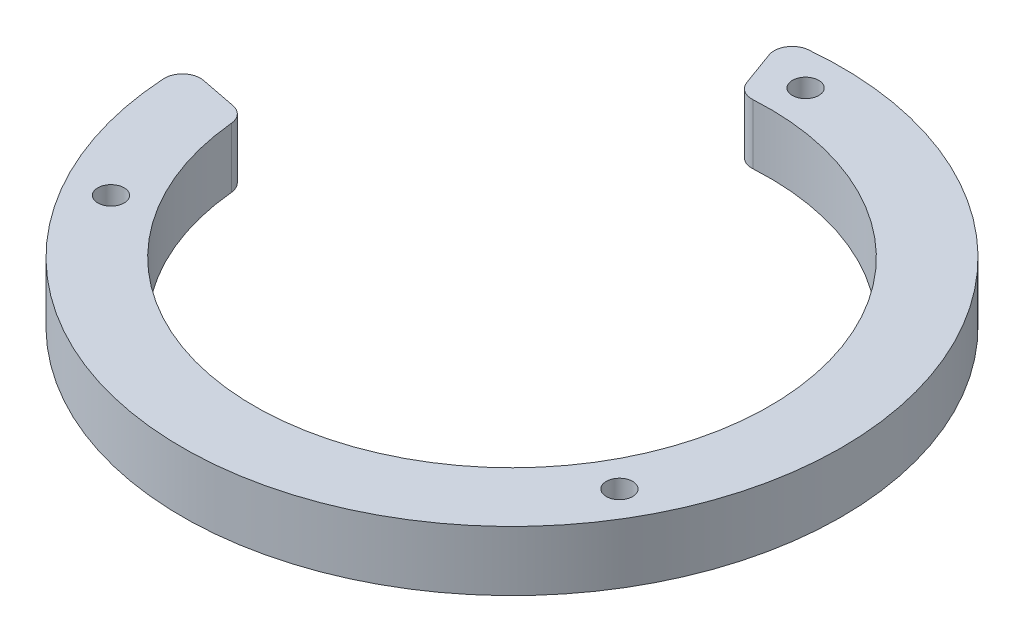
ISO-10303-21;
HEADER;
FILE_DESCRIPTION(('STEP AP214'),'2;1');
FILE_NAME('part.step','',(''),(''),'','','');
FILE_SCHEMA(('AUTOMOTIVE_DESIGN { 1 0 10303 214 1 1 1 1 }'));
ENDSEC;
DATA;
#1=APPLICATION_CONTEXT('core data for automotive mechanical design processes');
#2=APPLICATION_PROTOCOL_DEFINITION('international standard','automotive_design',2000,#1);
#3=PRODUCT_CONTEXT('',#1,'mechanical');
#4=PRODUCT('Part','Part','',(#3));
#5=PRODUCT_RELATED_PRODUCT_CATEGORY('part','',(#4));
#6=PRODUCT_DEFINITION_FORMATION('','',#4);
#7=PRODUCT_DEFINITION_CONTEXT('part definition',#1,'design');
#8=PRODUCT_DEFINITION('design','',#6,#7);
#9=PRODUCT_DEFINITION_SHAPE('','',#8);
#10=(LENGTH_UNIT() NAMED_UNIT(*) SI_UNIT(.MILLI.,.METRE.));
#11=(NAMED_UNIT(*) PLANE_ANGLE_UNIT() SI_UNIT($,.RADIAN.));
#12=(NAMED_UNIT(*) SI_UNIT($,.STERADIAN.) SOLID_ANGLE_UNIT());
#13=UNCERTAINTY_MEASURE_WITH_UNIT(LENGTH_MEASURE(1.E-05),#10,'distance_accuracy_value','');
#14=(GEOMETRIC_REPRESENTATION_CONTEXT(3) GLOBAL_UNCERTAINTY_ASSIGNED_CONTEXT((#13)) GLOBAL_UNIT_ASSIGNED_CONTEXT((#10,
#11,#12)) REPRESENTATION_CONTEXT('',''));
#15=CARTESIAN_POINT('',(0.,0.,0.));
#16=DIRECTION('',(0.,0.,1.));
#17=DIRECTION('',(1.,0.,0.));
#18=AXIS2_PLACEMENT_3D('',#15,#16,#17);
#19=CARTESIAN_POINT('',(0.,5.,0.));
#20=DIRECTION('',(0.,1.,0.));
#21=DIRECTION('',(0.,0.,1.));
#22=AXIS2_PLACEMENT_3D('',#19,#20,#21);
#23=PLANE('',#22);
#24=CARTESIAN_POINT('',(0.,5.,0.));
#25=DIRECTION('',(0.,1.,0.));
#26=DIRECTION('',(0.,0.,1.));
#27=AXIS2_PLACEMENT_3D('',#24,#25,#26);
#28=CIRCLE('',#27,27.5);
#29=CARTESIAN_POINT('',(-27.4512818962212,5.,1.63619138678829));
#30=VERTEX_POINT('',#29);
#31=CARTESIAN_POINT('',(-2.6465016763753,5.,-27.3723588475115));
#32=VERTEX_POINT('',#31);
#33=EDGE_CURVE('E175',#30,#32,#28,.T.);
#34=ORIENTED_EDGE('',*,*,#33,.T.);
#35=CARTESIAN_POINT('',(-2.5021470394821,5.,-25.8793210921927));
#36=DIRECTION('',(0.,1.,0.));
#37=DIRECTION('',(0.,0.,1.));
#38=AXIS2_PLACEMENT_3D('',#35,#36,#37);
#39=CIRCLE('',#38,1.5);
#40=CARTESIAN_POINT('',(-3.91168597066097,5.,-25.3662908772042));
#41=VERTEX_POINT('',#40);
#42=EDGE_CURVE('E203',#32,#41,#39,.T.);
#43=ORIENTED_EDGE('',*,*,#42,.T.);
#44=DIRECTION('',(0.342020143325664,0.,0.93969262078591));
#45=VECTOR('',#44,1.);
#46=CARTESIAN_POINT('',(-2.45335719744214,5.,-21.3595655026444));
#47=LINE('',#46,#45);
#48=CARTESIAN_POINT('',(-2.84732603014498,5.,-22.4419859744644));
#49=VERTEX_POINT('',#48);
#50=EDGE_CURVE('E125',#41,#49,#47,.T.);
#51=ORIENTED_EDGE('',*,*,#50,.T.);
#52=CARTESIAN_POINT('',(-1.43778709896612,5.,-22.9550161894529));
#53=DIRECTION('',(0.,1.,0.));
#54=DIRECTION('',(0.,0.,1.));
#55=AXIS2_PLACEMENT_3D('',#52,#53,#54);
#56=CIRCLE('',#55,1.5);
#57=CARTESIAN_POINT('',(-1.3440183751205,5.,-21.4579499162277));
#58=VERTEX_POINT('',#57);
#59=EDGE_CURVE('E200',#49,#58,#56,.T.);
#60=ORIENTED_EDGE('',*,*,#59,.T.);
#61=CARTESIAN_POINT('',(0.,5.,0.));
#62=DIRECTION('',(0.,1.,0.));
#63=DIRECTION('',(0.,0.,1.));
#64=AXIS2_PLACEMENT_3D('',#61,#62,#63);
#65=CIRCLE('',#64,21.5);
#66=CARTESIAN_POINT('',(-21.4063593406248,5.,2.00444001657446));
#67=VERTEX_POINT('',#66);
#68=EDGE_CURVE('E168',#67,#58,#65,.T.);
#69=ORIENTED_EDGE('',*,*,#68,.F.);
#70=CARTESIAN_POINT('',(-22.8998262713661,5.,2.1442846688936));
#71=DIRECTION('',(0.,1.,0.));
#72=DIRECTION('',(0.,0.,1.));
#73=AXIS2_PLACEMENT_3D('',#70,#71,#72);
#74=CIRCLE('',#73,1.5);
#75=CARTESIAN_POINT('',(-22.6119034544936,5.,0.67217718249045));
#76=VERTEX_POINT('',#75);
#77=EDGE_CURVE('E59',#67,#76,#74,.T.);
#78=ORIENTED_EDGE('',*,*,#77,.T.);
#79=DIRECTION('',(-0.981404990935436,0.,-0.191948544581656));
#80=VECTOR('',#79,1.);
#81=CARTESIAN_POINT('',(-21.4814350121146,5.,0.893280370485552));
#82=LINE('',#81,#80);
#83=CARTESIAN_POINT('',(-25.6660164304639,5.,0.0748370974694069));
#84=VERTEX_POINT('',#83);
#85=EDGE_CURVE('E134',#76,#84,#82,.T.);
#86=ORIENTED_EDGE('',*,*,#85,.T.);
#87=CARTESIAN_POINT('',(-25.9539392473364,5.,1.54694458387256));
#88=DIRECTION('',(0.,1.,0.));
#89=DIRECTION('',(0.,0.,1.));
#90=AXIS2_PLACEMENT_3D('',#87,#88,#89);
#91=CIRCLE('',#90,1.5);
#92=EDGE_CURVE('E197',#84,#30,#91,.T.);
#93=ORIENTED_EDGE('',*,*,#92,.T.);
#94=EDGE_LOOP('',(#34,#43,#51,#60,#69,#78,#86,#93));
#95=FACE_BOUND('',#94,.T.);
#96=CARTESIAN_POINT('',(21.2176223927188,5.,12.25));
#97=DIRECTION('',(0.,1.,0.));
#98=DIRECTION('',(0.,0.,1.));
#99=AXIS2_PLACEMENT_3D('',#96,#97,#98);
#100=CIRCLE('',#99,1.1);
#101=CARTESIAN_POINT('',(21.2176223927188,5.,13.35));
#102=VERTEX_POINT('',#101);
#103=EDGE_CURVE('E152',#102,#102,#100,.T.);
#104=ORIENTED_EDGE('',*,*,#103,.F.);
#105=EDGE_LOOP('',(#104));
#106=FACE_BOUND('',#105,.T.);
#107=CARTESIAN_POINT('',(0.,5.,-24.5));
#108=DIRECTION('',(0.,1.,0.));
#109=DIRECTION('',(0.,0.,1.));
#110=AXIS2_PLACEMENT_3D('',#107,#108,#109);
#111=CIRCLE('',#110,1.1);
#112=CARTESIAN_POINT('',(0.,5.,-23.4));
#113=VERTEX_POINT('',#112);
#114=EDGE_CURVE('E160',#113,#113,#111,.T.);
#115=ORIENTED_EDGE('',*,*,#114,.F.);
#116=EDGE_LOOP('',(#115));
#117=FACE_BOUND('',#116,.T.);
#118=CARTESIAN_POINT('',(-21.2176223927187,5.,12.25));
#119=DIRECTION('',(0.,1.,0.));
#120=DIRECTION('',(0.,0.,1.));
#121=AXIS2_PLACEMENT_3D('',#118,#119,#120);
#122=CIRCLE('',#121,1.10000000000001);
#123=CARTESIAN_POINT('',(-21.2176223927187,5.,13.35));
#124=VERTEX_POINT('',#123);
#125=EDGE_CURVE('E143',#124,#124,#122,.T.);
#126=ORIENTED_EDGE('',*,*,#125,.F.);
#127=EDGE_LOOP('',(#126));
#128=FACE_BOUND('',#127,.T.);
#129=ADVANCED_FACE('F38',(#95,#106,#117,#128),#23,.T.);
#130=CARTESIAN_POINT('',(0.,0.,0.));
#131=DIRECTION('',(0.,1.,0.));
#132=DIRECTION('',(0.,0.,1.));
#133=AXIS2_PLACEMENT_3D('',#130,#131,#132);
#134=PLANE('',#133);
#135=DIRECTION('',(0.342020143325664,0.,0.93969262078591));
#136=VECTOR('',#135,1.);
#137=CARTESIAN_POINT('',(-2.45335719744214,0.,-21.3595655026444));
#138=LINE('',#137,#136);
#139=CARTESIAN_POINT('',(-3.91168597066097,0.,-25.3662908772042));
#140=VERTEX_POINT('',#139);
#141=CARTESIAN_POINT('',(-2.84732603014498,0.,-22.4419859744644));
#142=VERTEX_POINT('',#141);
#143=EDGE_CURVE('E122',#140,#142,#138,.T.);
#144=ORIENTED_EDGE('',*,*,#143,.F.);
#145=CARTESIAN_POINT('',(-2.5021470394821,0.,-25.8793210921927));
#146=DIRECTION('',(0.,1.,0.));
#147=DIRECTION('',(0.,0.,1.));
#148=AXIS2_PLACEMENT_3D('',#145,#146,#147);
#149=CIRCLE('',#148,1.5);
#150=CARTESIAN_POINT('',(-2.6465016763753,0.,-27.3723588475115));
#151=VERTEX_POINT('',#150);
#152=EDGE_CURVE('E104',#140,#151,#149,.F.);
#153=ORIENTED_EDGE('',*,*,#152,.T.);
#154=CARTESIAN_POINT('',(0.,0.,0.));
#155=DIRECTION('',(0.,1.,0.));
#156=DIRECTION('',(0.,0.,1.));
#157=AXIS2_PLACEMENT_3D('',#154,#155,#156);
#158=CIRCLE('',#157,27.5);
#159=CARTESIAN_POINT('',(-27.4512818962212,0.,1.63619138678829));
#160=VERTEX_POINT('',#159);
#161=EDGE_CURVE('E172',#160,#151,#158,.T.);
#162=ORIENTED_EDGE('',*,*,#161,.F.);
#163=CARTESIAN_POINT('',(-25.9539392473364,0.,1.54694458387256));
#164=DIRECTION('',(0.,1.,0.));
#165=DIRECTION('',(0.,0.,1.));
#166=AXIS2_PLACEMENT_3D('',#163,#164,#165);
#167=CIRCLE('',#166,1.5);
#168=CARTESIAN_POINT('',(-25.6660164304639,0.,0.0748370974694069));
#169=VERTEX_POINT('',#168);
#170=EDGE_CURVE('E185',#160,#169,#167,.F.);
#171=ORIENTED_EDGE('',*,*,#170,.T.);
#172=DIRECTION('',(-0.981404990935436,0.,-0.191948544581656));
#173=VECTOR('',#172,1.);
#174=CARTESIAN_POINT('',(-21.4814350121146,0.,0.893280370485552));
#175=LINE('',#174,#173);
#176=CARTESIAN_POINT('',(-22.6119034544936,0.,0.67217718249045));
#177=VERTEX_POINT('',#176);
#178=EDGE_CURVE('E135',#177,#169,#175,.T.);
#179=ORIENTED_EDGE('',*,*,#178,.F.);
#180=CARTESIAN_POINT('',(-22.8998262713661,0.,2.1442846688936));
#181=DIRECTION('',(0.,1.,0.));
#182=DIRECTION('',(0.,0.,1.));
#183=AXIS2_PLACEMENT_3D('',#180,#181,#182);
#184=CIRCLE('',#183,1.5);
#185=CARTESIAN_POINT('',(-21.4063593406248,0.,2.00444001657446));
#186=VERTEX_POINT('',#185);
#187=EDGE_CURVE('E127',#177,#186,#184,.F.);
#188=ORIENTED_EDGE('',*,*,#187,.T.);
#189=CARTESIAN_POINT('',(0.,0.,0.));
#190=DIRECTION('',(0.,1.,0.));
#191=DIRECTION('',(0.,0.,1.));
#192=AXIS2_PLACEMENT_3D('',#189,#190,#191);
#193=CIRCLE('',#192,21.5);
#194=CARTESIAN_POINT('',(-1.3440183751205,0.,-21.4579499162277));
#195=VERTEX_POINT('',#194);
#196=EDGE_CURVE('E164',#186,#195,#193,.T.);
#197=ORIENTED_EDGE('',*,*,#196,.T.);
#198=CARTESIAN_POINT('',(-1.43778709896612,0.,-22.9550161894529));
#199=DIRECTION('',(0.,1.,0.));
#200=DIRECTION('',(0.,0.,1.));
#201=AXIS2_PLACEMENT_3D('',#198,#199,#200);
#202=CIRCLE('',#201,1.5);
#203=EDGE_CURVE('E116',#195,#142,#202,.F.);
#204=ORIENTED_EDGE('',*,*,#203,.T.);
#205=EDGE_LOOP('',(#144,#153,#162,#171,#179,#188,#197,#204));
#206=FACE_BOUND('',#205,.T.);
#207=CARTESIAN_POINT('',(0.,0.,-24.5));
#208=DIRECTION('',(0.,1.,0.));
#209=DIRECTION('',(0.,0.,1.));
#210=AXIS2_PLACEMENT_3D('',#207,#208,#209);
#211=CIRCLE('',#210,1.1);
#212=CARTESIAN_POINT('',(0.,0.,-23.4));
#213=VERTEX_POINT('',#212);
#214=EDGE_CURVE('E156',#213,#213,#211,.T.);
#215=ORIENTED_EDGE('',*,*,#214,.T.);
#216=EDGE_LOOP('',(#215));
#217=FACE_BOUND('',#216,.T.);
#218=CARTESIAN_POINT('',(21.2176223927188,0.,12.25));
#219=DIRECTION('',(0.,1.,0.));
#220=DIRECTION('',(0.,0.,1.));
#221=AXIS2_PLACEMENT_3D('',#218,#219,#220);
#222=CIRCLE('',#221,1.1);
#223=CARTESIAN_POINT('',(21.2176223927188,0.,13.35));
#224=VERTEX_POINT('',#223);
#225=EDGE_CURVE('E147',#224,#224,#222,.T.);
#226=ORIENTED_EDGE('',*,*,#225,.T.);
#227=EDGE_LOOP('',(#226));
#228=FACE_BOUND('',#227,.T.);
#229=CARTESIAN_POINT('',(-21.2176223927187,0.,12.25));
#230=DIRECTION('',(0.,1.,0.));
#231=DIRECTION('',(0.,0.,1.));
#232=AXIS2_PLACEMENT_3D('',#229,#230,#231);
#233=CIRCLE('',#232,1.10000000000001);
#234=CARTESIAN_POINT('',(-21.2176223927187,0.,13.35));
#235=VERTEX_POINT('',#234);
#236=EDGE_CURVE('E148',#235,#235,#233,.T.);
#237=ORIENTED_EDGE('',*,*,#236,.T.);
#238=EDGE_LOOP('',(#237));
#239=FACE_BOUND('',#238,.T.);
#240=ADVANCED_FACE('F130',(#206,#217,#228,#239),#134,.F.);
#241=CARTESIAN_POINT('',(0.,5.,0.));
#242=DIRECTION('',(0.,-1.,0.));
#243=DIRECTION('',(0.,0.,-1.));
#244=AXIS2_PLACEMENT_3D('',#241,#242,#243);
#245=CYLINDRICAL_SURFACE('',#244,27.5);
#246=ORIENTED_EDGE('',*,*,#161,.T.);
#247=DIRECTION('',(0.,-1.,0.));
#248=VECTOR('',#247,1.);
#249=CARTESIAN_POINT('',(-2.6465016763753,5.,-27.3723588475115));
#250=LINE('',#249,#248);
#251=EDGE_CURVE('E109',#151,#32,#250,.F.);
#252=ORIENTED_EDGE('',*,*,#251,.T.);
#253=ORIENTED_EDGE('',*,*,#33,.F.);
#254=DIRECTION('',(0.,-1.,0.));
#255=VECTOR('',#254,1.);
#256=CARTESIAN_POINT('',(-27.4512818962212,5.,1.63619138678829));
#257=LINE('',#256,#255);
#258=EDGE_CURVE('E115',#30,#160,#257,.T.);
#259=ORIENTED_EDGE('',*,*,#258,.T.);
#260=EDGE_LOOP('',(#246,#252,#253,#259));
#261=FACE_BOUND('',#260,.T.);
#262=ADVANCED_FACE('F225',(#261),#245,.T.);
#263=CARTESIAN_POINT('',(0.,5.,0.));
#264=DIRECTION('',(0.,-1.,0.));
#265=DIRECTION('',(0.,0.,-1.));
#266=AXIS2_PLACEMENT_3D('',#263,#264,#265);
#267=CYLINDRICAL_SURFACE('',#266,21.5);
#268=ORIENTED_EDGE('',*,*,#68,.T.);
#269=DIRECTION('',(0.,-1.,0.));
#270=VECTOR('',#269,1.);
#271=CARTESIAN_POINT('',(-1.3440183751205,5.,-21.4579499162277));
#272=LINE('',#271,#270);
#273=EDGE_CURVE('E209',#58,#195,#272,.T.);
#274=ORIENTED_EDGE('',*,*,#273,.T.);
#275=ORIENTED_EDGE('',*,*,#196,.F.);
#276=DIRECTION('',(0.,-1.,0.));
#277=VECTOR('',#276,1.);
#278=CARTESIAN_POINT('',(-21.4063593406248,5.,2.00444001657446));
#279=LINE('',#278,#277);
#280=EDGE_CURVE('E206',#186,#67,#279,.F.);
#281=ORIENTED_EDGE('',*,*,#280,.T.);
#282=EDGE_LOOP('',(#268,#274,#275,#281));
#283=FACE_BOUND('',#282,.T.);
#284=ADVANCED_FACE('F233',(#283),#267,.F.);
#285=CARTESIAN_POINT('',(0.,5.,-24.5));
#286=DIRECTION('',(0.,-1.,0.));
#287=DIRECTION('',(0.,0.,-1.));
#288=AXIS2_PLACEMENT_3D('',#285,#286,#287);
#289=CYLINDRICAL_SURFACE('',#288,1.1);
#290=ORIENTED_EDGE('',*,*,#114,.T.);
#291=EDGE_LOOP('',(#290));
#292=FACE_BOUND('',#291,.T.);
#293=ORIENTED_EDGE('',*,*,#214,.F.);
#294=EDGE_LOOP('',(#293));
#295=FACE_BOUND('',#294,.T.);
#296=ADVANCED_FACE('F306',(#292,#295),#289,.F.);
#297=CARTESIAN_POINT('',(21.2176223927188,5.,12.25));
#298=DIRECTION('',(0.,-1.,0.));
#299=DIRECTION('',(0.,0.,-1.));
#300=AXIS2_PLACEMENT_3D('',#297,#298,#299);
#301=CYLINDRICAL_SURFACE('',#300,1.1);
#302=ORIENTED_EDGE('',*,*,#103,.T.);
#303=EDGE_LOOP('',(#302));
#304=FACE_BOUND('',#303,.T.);
#305=ORIENTED_EDGE('',*,*,#225,.F.);
#306=EDGE_LOOP('',(#305));
#307=FACE_BOUND('',#306,.T.);
#308=ADVANCED_FACE('F297',(#304,#307),#301,.F.);
#309=CARTESIAN_POINT('',(-21.2176223927187,5.,12.25));
#310=DIRECTION('',(0.,-1.,0.));
#311=DIRECTION('',(0.,0.,-1.));
#312=AXIS2_PLACEMENT_3D('',#309,#310,#311);
#313=CYLINDRICAL_SURFACE('',#312,1.10000000000001);
#314=ORIENTED_EDGE('',*,*,#125,.T.);
#315=EDGE_LOOP('',(#314));
#316=FACE_BOUND('',#315,.T.);
#317=ORIENTED_EDGE('',*,*,#236,.F.);
#318=EDGE_LOOP('',(#317));
#319=FACE_BOUND('',#318,.T.);
#320=ADVANCED_FACE('F289',(#316,#319),#313,.F.);
#321=CARTESIAN_POINT('',(-21.4814350121146,5.,0.893280370485552));
#322=DIRECTION('',(-0.191948544581656,0.,0.981404990935436));
#323=DIRECTION('',(0.981404990935436,0.,0.191948544581656));
#324=AXIS2_PLACEMENT_3D('',#321,#322,#323);
#325=PLANE('',#324);
#326=ORIENTED_EDGE('',*,*,#178,.T.);
#327=DIRECTION('',(0.,-1.,0.));
#328=VECTOR('',#327,1.);
#329=CARTESIAN_POINT('',(-25.6660164304639,5.,0.074837097469407));
#330=LINE('',#329,#328);
#331=EDGE_CURVE('E11',#169,#84,#330,.F.);
#332=ORIENTED_EDGE('',*,*,#331,.T.);
#333=ORIENTED_EDGE('',*,*,#85,.F.);
#334=DIRECTION('',(0.,1.,0.));
#335=VECTOR('',#334,1.);
#336=CARTESIAN_POINT('',(-22.6119034544936,0.,0.672177182490449));
#337=LINE('',#336,#335);
#338=EDGE_CURVE('E47',#76,#177,#337,.F.);
#339=ORIENTED_EDGE('',*,*,#338,.T.);
#340=EDGE_LOOP('',(#326,#332,#333,#339));
#341=FACE_BOUND('',#340,.T.);
#342=ADVANCED_FACE('F216',(#341),#325,.F.);
#343=CARTESIAN_POINT('',(-2.45335719744214,5.,-21.3595655026444));
#344=DIRECTION('',(0.93969262078591,0.,-0.342020143325664));
#345=DIRECTION('',(-0.342020143325664,0.,-0.93969262078591));
#346=AXIS2_PLACEMENT_3D('',#343,#344,#345);
#347=PLANE('',#346);
#348=ORIENTED_EDGE('',*,*,#50,.F.);
#349=DIRECTION('',(0.,-1.,0.));
#350=VECTOR('',#349,1.);
#351=CARTESIAN_POINT('',(-3.91168597066097,5.,-25.3662908772042));
#352=LINE('',#351,#350);
#353=EDGE_CURVE('E108',#41,#140,#352,.T.);
#354=ORIENTED_EDGE('',*,*,#353,.T.);
#355=ORIENTED_EDGE('',*,*,#143,.T.);
#356=DIRECTION('',(0.,1.,0.));
#357=VECTOR('',#356,1.);
#358=CARTESIAN_POINT('',(-2.84732603014498,5.,-22.4419859744644));
#359=LINE('',#358,#357);
#360=EDGE_CURVE('E128',#142,#49,#359,.T.);
#361=ORIENTED_EDGE('',*,*,#360,.T.);
#362=EDGE_LOOP('',(#348,#354,#355,#361));
#363=FACE_BOUND('',#362,.T.);
#364=ADVANCED_FACE('F121',(#363),#347,.F.);
#365=CARTESIAN_POINT('',(-2.5021470394821,5.,-25.8793210921927));
#366=DIRECTION('',(0.,-1.,0.));
#367=DIRECTION('',(0.,0.,-1.));
#368=AXIS2_PLACEMENT_3D('',#365,#366,#367);
#369=CYLINDRICAL_SURFACE('',#368,1.5);
#370=ORIENTED_EDGE('',*,*,#42,.F.);
#371=ORIENTED_EDGE('',*,*,#251,.F.);
#372=ORIENTED_EDGE('',*,*,#152,.F.);
#373=ORIENTED_EDGE('',*,*,#353,.F.);
#374=EDGE_LOOP('',(#370,#371,#372,#373));
#375=FACE_BOUND('',#374,.T.);
#376=ADVANCED_FACE('F107',(#375),#369,.T.);
#377=CARTESIAN_POINT('',(-1.43778709896612,5.,-22.9550161894529));
#378=DIRECTION('',(0.,-1.,0.));
#379=DIRECTION('',(0.,0.,-1.));
#380=AXIS2_PLACEMENT_3D('',#377,#378,#379);
#381=CYLINDRICAL_SURFACE('',#380,1.5);
#382=ORIENTED_EDGE('',*,*,#59,.F.);
#383=ORIENTED_EDGE('',*,*,#360,.F.);
#384=ORIENTED_EDGE('',*,*,#203,.F.);
#385=ORIENTED_EDGE('',*,*,#273,.F.);
#386=EDGE_LOOP('',(#382,#383,#384,#385));
#387=FACE_BOUND('',#386,.T.);
#388=ADVANCED_FACE('F231',(#387),#381,.T.);
#389=CARTESIAN_POINT('',(-25.9539392473364,5.,1.54694458387256));
#390=DIRECTION('',(0.,-1.,0.));
#391=DIRECTION('',(0.,0.,-1.));
#392=AXIS2_PLACEMENT_3D('',#389,#390,#391);
#393=CYLINDRICAL_SURFACE('',#392,1.5);
#394=ORIENTED_EDGE('',*,*,#92,.F.);
#395=ORIENTED_EDGE('',*,*,#331,.F.);
#396=ORIENTED_EDGE('',*,*,#170,.F.);
#397=ORIENTED_EDGE('',*,*,#258,.F.);
#398=EDGE_LOOP('',(#394,#395,#396,#397));
#399=FACE_BOUND('',#398,.T.);
#400=ADVANCED_FACE('F222',(#399),#393,.T.);
#401=CARTESIAN_POINT('',(-22.8998262713661,5.,2.1442846688936));
#402=DIRECTION('',(0.,-1.,0.));
#403=DIRECTION('',(0.,0.,-1.));
#404=AXIS2_PLACEMENT_3D('',#401,#402,#403);
#405=CYLINDRICAL_SURFACE('',#404,1.5);
#406=ORIENTED_EDGE('',*,*,#77,.F.);
#407=ORIENTED_EDGE('',*,*,#280,.F.);
#408=ORIENTED_EDGE('',*,*,#187,.F.);
#409=ORIENTED_EDGE('',*,*,#338,.F.);
#410=EDGE_LOOP('',(#406,#407,#408,#409));
#411=FACE_BOUND('',#410,.T.);
#412=ADVANCED_FACE('F40',(#411),#405,.T.);
#413=CLOSED_SHELL('',(#129,#240,#262,#284,#296,#308,#320,#342,#364,#376,#388,#400,#412));
#414=MANIFOLD_SOLID_BREP('B2',#413);
#415=ADVANCED_BREP_SHAPE_REPRESENTATION('',(#18,#414),#14);
#416=SHAPE_DEFINITION_REPRESENTATION(#9,#415);
ENDSEC;
END-ISO-10303-21;
